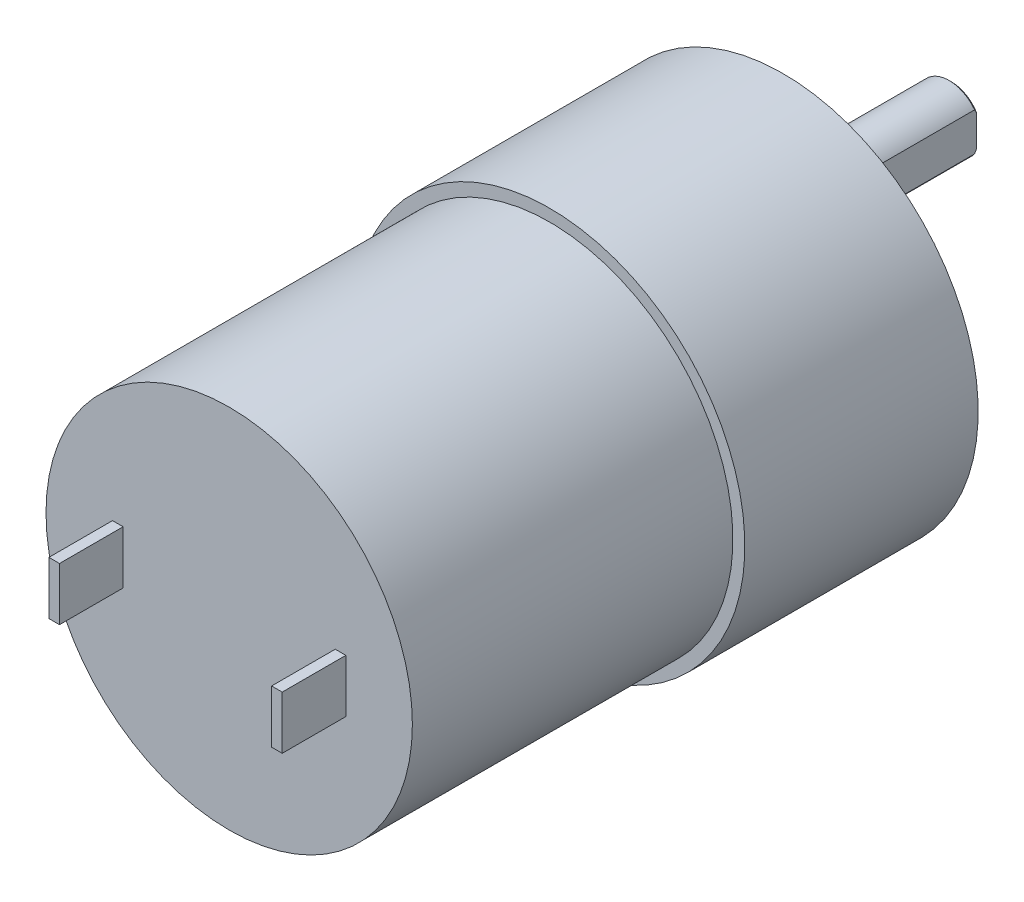
ISO-10303-21;
HEADER;
FILE_DESCRIPTION(('STEP AP214'),'2;1');
FILE_NAME('part.step','',(''),(''),'','','');
FILE_SCHEMA(('AUTOMOTIVE_DESIGN { 1 0 10303 214 1 1 1 1 }'));
ENDSEC;
DATA;
#1=APPLICATION_CONTEXT('core data for automotive mechanical design processes');
#2=APPLICATION_PROTOCOL_DEFINITION('international standard','automotive_design',2000,#1);
#3=PRODUCT_CONTEXT('',#1,'mechanical');
#4=PRODUCT('Part','Part','',(#3));
#5=PRODUCT_RELATED_PRODUCT_CATEGORY('part','',(#4));
#6=PRODUCT_DEFINITION_FORMATION('','',#4);
#7=PRODUCT_DEFINITION_CONTEXT('part definition',#1,'design');
#8=PRODUCT_DEFINITION('design','',#6,#7);
#9=PRODUCT_DEFINITION_SHAPE('','',#8);
#10=(LENGTH_UNIT() NAMED_UNIT(*) SI_UNIT(.MILLI.,.METRE.));
#11=(NAMED_UNIT(*) PLANE_ANGLE_UNIT() SI_UNIT($,.RADIAN.));
#12=(NAMED_UNIT(*) SI_UNIT($,.STERADIAN.) SOLID_ANGLE_UNIT());
#13=UNCERTAINTY_MEASURE_WITH_UNIT(LENGTH_MEASURE(1.E-05),#10,'distance_accuracy_value','');
#14=(GEOMETRIC_REPRESENTATION_CONTEXT(3) GLOBAL_UNCERTAINTY_ASSIGNED_CONTEXT((#13)) GLOBAL_UNIT_ASSIGNED_CONTEXT((#10,
#11,#12)) REPRESENTATION_CONTEXT('',''));
#15=CARTESIAN_POINT('',(0.,0.,0.));
#16=DIRECTION('',(0.,0.,1.));
#17=DIRECTION('',(1.,0.,0.));
#18=AXIS2_PLACEMENT_3D('',#15,#16,#17);
#19=CARTESIAN_POINT('',(-4.6,0.,-22.86));
#20=DIRECTION('',(-1.,0.,0.));
#21=DIRECTION('',(0.,0.,1.));
#22=AXIS2_PLACEMENT_3D('',#19,#20,#21);
#23=PLANE('',#22);
#24=DIRECTION('',(0.,0.,1.));
#25=VECTOR('',#24,1.);
#26=CARTESIAN_POINT('',(-4.6,-1.8,-22.86));
#27=LINE('',#26,#25);
#28=CARTESIAN_POINT('',(-4.6,-1.8,-22.66));
#29=VERTEX_POINT('',#28);
#30=CARTESIAN_POINT('',(-4.6,-1.8,-10.668));
#31=VERTEX_POINT('',#30);
#32=EDGE_CURVE('E252',#29,#31,#27,.T.);
#33=ORIENTED_EDGE('',*,*,#32,.F.);
#34=CARTESIAN_POINT('',(-4.6,-1.8,-22.66));
#35=CARTESIAN_POINT('',(-4.6,-1.77070203501496,-22.6775781337646));
#36=CARTESIAN_POINT('',(-4.6,-1.7412829409263,-22.6949555529574));
#37=CARTESIAN_POINT('',(-4.6,-1.68219669104404,-22.7292652120088));
#38=CARTESIAN_POINT('',(-4.6,-1.65252960207593,-22.7461975670036));
#39=CARTESIAN_POINT('',(-4.6,-1.5929254182054,-22.7795830473789));
#40=CARTESIAN_POINT('',(-4.6,-1.56298831567906,-22.796036159172));
#41=CARTESIAN_POINT('',(-4.6,-1.50282370565395,-22.8284214305054));
#42=CARTESIAN_POINT('',(-4.6,-1.47259612428592,-22.8443534527386));
#43=CARTESIAN_POINT('',(-4.6,-1.44222051018599,-22.8600000000006));
#44=B_SPLINE_CURVE_WITH_KNOTS('',3,(#34,#35,#36,#37,#38,#39,#40,#41,#42,#43),.UNSPECIFIED.,.F.,
.F.,(4,2,2,2,4),(0.,0.102500083338184,0.204973384069477,0.307449587280265,0.409952578891135),.UNSPECIFIED.);
#45=CARTESIAN_POINT('',(-4.6,-1.44222051018562,-22.86));
#46=VERTEX_POINT('',#45);
#47=EDGE_CURVE('E50',#29,#46,#44,.T.);
#48=ORIENTED_EDGE('',*,*,#47,.T.);
#49=DIRECTION('',(0.,-1.,0.));
#50=VECTOR('',#49,1.);
#51=CARTESIAN_POINT('',(-4.6,0.,-22.86));
#52=LINE('',#51,#50);
#53=CARTESIAN_POINT('',(-4.6,1.44222051018561,-22.86));
#54=VERTEX_POINT('',#53);
#55=EDGE_CURVE('E249',#54,#46,#52,.T.);
#56=ORIENTED_EDGE('',*,*,#55,.F.);
#57=CARTESIAN_POINT('',(-4.6,1.44222051018561,-22.86));
#58=CARTESIAN_POINT('',(-4.6,1.47259612428575,-22.8443534527384));
#59=CARTESIAN_POINT('',(-4.6,1.50282370565389,-22.8284214305053));
#60=CARTESIAN_POINT('',(-4.6,1.56298831567908,-22.7960361591721));
#61=CARTESIAN_POINT('',(-4.6,1.5929254182054,-22.7795830473789));
#62=CARTESIAN_POINT('',(-4.6,1.6525296020759,-22.7461975670035));
#63=CARTESIAN_POINT('',(-4.6,1.682196691044,-22.7292652120088));
#64=CARTESIAN_POINT('',(-4.6,1.7412829409263,-22.6949555529574));
#65=CARTESIAN_POINT('',(-4.6,1.77070203501501,-22.6775781337648));
#66=CARTESIAN_POINT('',(-4.6,1.80000000000012,-22.6600000000003));
#67=B_SPLINE_CURVE_WITH_KNOTS('',3,(#57,#58,#59,#60,#61,#62,#63,#64,#65,#66),.UNSPECIFIED.,.F.,
.F.,(4,2,2,2,4),(0.,0.102502991610884,0.204979194821683,0.307452495552973,0.409952578891161),.UNSPECIFIED.);
#68=CARTESIAN_POINT('',(-4.6,1.8,-22.66));
#69=VERTEX_POINT('',#68);
#70=EDGE_CURVE('E270',#54,#69,#67,.T.);
#71=ORIENTED_EDGE('',*,*,#70,.T.);
#72=DIRECTION('',(0.,0.,1.));
#73=VECTOR('',#72,1.);
#74=CARTESIAN_POINT('',(-4.6,1.8,-22.86));
#75=LINE('',#74,#73);
#76=CARTESIAN_POINT('',(-4.6,1.8,-10.668));
#77=VERTEX_POINT('',#76);
#78=EDGE_CURVE('E251',#69,#77,#75,.T.);
#79=ORIENTED_EDGE('',*,*,#78,.T.);
#80=DIRECTION('',(0.,-1.,0.));
#81=VECTOR('',#80,1.);
#82=CARTESIAN_POINT('',(-4.6,0.,-10.668));
#83=LINE('',#82,#81);
#84=EDGE_CURVE('E243',#77,#31,#83,.T.);
#85=ORIENTED_EDGE('',*,*,#84,.T.);
#86=EDGE_LOOP('',(#33,#48,#56,#71,#79,#85));
#87=FACE_BOUND('',#86,.T.);
#88=ADVANCED_FACE('F35',(#87),#23,.F.);
#89=CARTESIAN_POINT('',(0.,0.,-6.5));
#90=DIRECTION('',(0.,0.,1.));
#91=DIRECTION('',(1.,0.,0.));
#92=AXIS2_PLACEMENT_3D('',#89,#90,#91);
#93=PLANE('',#92);
#94=CARTESIAN_POINT('',(-7.,0.,-6.5));
#95=DIRECTION('',(0.,0.,1.));
#96=DIRECTION('',(1.,0.,0.));
#97=AXIS2_PLACEMENT_3D('',#94,#95,#96);
#98=CIRCLE('',#97,5.49999999999993);
#99=CARTESIAN_POINT('',(-1.50000000000007,0.,-6.5));
#100=VERTEX_POINT('',#99);
#101=EDGE_CURVE('E11',#100,#100,#98,.F.);
#102=ORIENTED_EDGE('',*,*,#101,.T.);
#103=EDGE_LOOP('',(#102));
#104=FACE_BOUND('',#103,.T.);
#105=CARTESIAN_POINT('',(-7.,0.,-6.5));
#106=DIRECTION('',(0.,0.,1.));
#107=DIRECTION('',(1.,0.,0.));
#108=AXIS2_PLACEMENT_3D('',#105,#106,#107);
#109=CIRCLE('',#108,3.);
#110=CARTESIAN_POINT('',(-4.,0.,-6.5));
#111=VERTEX_POINT('',#110);
#112=EDGE_CURVE('E261',#111,#111,#109,.T.);
#113=ORIENTED_EDGE('',*,*,#112,.T.);
#114=EDGE_LOOP('',(#113));
#115=FACE_BOUND('',#114,.T.);
#116=ADVANCED_FACE('F287',(#104,#115),#93,.F.);
#117=CARTESIAN_POINT('',(0.,0.,0.));
#118=DIRECTION('',(0.,0.,1.));
#119=DIRECTION('',(1.,0.,0.));
#120=AXIS2_PLACEMENT_3D('',#117,#118,#119);
#121=PLANE('',#120);
#122=CARTESIAN_POINT('',(13.4233937586587,-7.75000000000013,0.));
#123=DIRECTION('',(0.,0.,-1.));
#124=DIRECTION('',(-1.,0.,0.));
#125=AXIS2_PLACEMENT_3D('',#122,#123,#124);
#126=CIRCLE('',#125,1.24999999999999);
#127=CARTESIAN_POINT('',(12.1733937586587,-7.75000000000013,0.));
#128=VERTEX_POINT('',#127);
#129=EDGE_CURVE('E145',#128,#128,#126,.T.);
#130=ORIENTED_EDGE('',*,*,#129,.F.);
#131=EDGE_LOOP('',(#130));
#132=FACE_BOUND('',#131,.T.);
#133=CARTESIAN_POINT('',(0.,-15.5,0.));
#134=DIRECTION('',(0.,0.,-1.));
#135=DIRECTION('',(-1.,0.,0.));
#136=AXIS2_PLACEMENT_3D('',#133,#134,#135);
#137=CIRCLE('',#136,1.24999999999999);
#138=CARTESIAN_POINT('',(-1.24999999999996,-15.5,0.));
#139=VERTEX_POINT('',#138);
#140=EDGE_CURVE('E144',#139,#139,#137,.T.);
#141=ORIENTED_EDGE('',*,*,#140,.F.);
#142=EDGE_LOOP('',(#141));
#143=FACE_BOUND('',#142,.T.);
#144=CARTESIAN_POINT('',(0.,15.5,0.));
#145=DIRECTION('',(0.,0.,-1.));
#146=DIRECTION('',(-1.,0.,0.));
#147=AXIS2_PLACEMENT_3D('',#144,#145,#146);
#148=CIRCLE('',#147,1.24999999999999);
#149=CARTESIAN_POINT('',(-1.24999999999991,15.5,0.));
#150=VERTEX_POINT('',#149);
#151=EDGE_CURVE('E155',#150,#150,#148,.T.);
#152=ORIENTED_EDGE('',*,*,#151,.F.);
#153=EDGE_LOOP('',(#152));
#154=FACE_BOUND('',#153,.T.);
#155=CARTESIAN_POINT('',(-13.4233937586588,7.75000000000004,0.));
#156=DIRECTION('',(0.,0.,-1.));
#157=DIRECTION('',(-1.,0.,0.));
#158=AXIS2_PLACEMENT_3D('',#155,#156,#157);
#159=CIRCLE('',#158,1.24999999999999);
#160=CARTESIAN_POINT('',(-14.6733937586588,7.75000000000004,0.));
#161=VERTEX_POINT('',#160);
#162=EDGE_CURVE('E161',#161,#161,#159,.T.);
#163=ORIENTED_EDGE('',*,*,#162,.F.);
#164=EDGE_LOOP('',(#163));
#165=FACE_BOUND('',#164,.T.);
#166=CARTESIAN_POINT('',(-13.4233937586588,-7.74999999999999,0.));
#167=DIRECTION('',(0.,0.,-1.));
#168=DIRECTION('',(-1.,0.,0.));
#169=AXIS2_PLACEMENT_3D('',#166,#167,#168);
#170=CIRCLE('',#169,1.24999999999999);
#171=CARTESIAN_POINT('',(-14.6733937586588,-7.74999999999999,0.));
#172=VERTEX_POINT('',#171);
#173=EDGE_CURVE('E167',#172,#172,#170,.T.);
#174=ORIENTED_EDGE('',*,*,#173,.F.);
#175=EDGE_LOOP('',(#174));
#176=FACE_BOUND('',#175,.T.);
#177=CARTESIAN_POINT('',(13.4233937586589,7.7499999999999,0.));
#178=DIRECTION('',(0.,0.,-1.));
#179=DIRECTION('',(-1.,0.,0.));
#180=AXIS2_PLACEMENT_3D('',#177,#178,#179);
#181=CIRCLE('',#180,1.24999999999999);
#182=CARTESIAN_POINT('',(12.1733937586589,7.7499999999999,0.));
#183=VERTEX_POINT('',#182);
#184=EDGE_CURVE('E173',#183,#183,#181,.T.);
#185=ORIENTED_EDGE('',*,*,#184,.F.);
#186=EDGE_LOOP('',(#185));
#187=FACE_BOUND('',#186,.T.);
#188=CARTESIAN_POINT('',(-7.,0.,0.));
#189=DIRECTION('',(0.,0.,1.));
#190=DIRECTION('',(1.,0.,0.));
#191=AXIS2_PLACEMENT_3D('',#188,#189,#190);
#192=CIRCLE('',#191,6.);
#193=CARTESIAN_POINT('',(-0.999999999999999,0.,0.));
#194=VERTEX_POINT('',#193);
#195=EDGE_CURVE('E254',#194,#194,#192,.T.);
#196=ORIENTED_EDGE('',*,*,#195,.T.);
#197=EDGE_LOOP('',(#196));
#198=FACE_BOUND('',#197,.T.);
#199=CARTESIAN_POINT('',(0.,0.,0.));
#200=DIRECTION('',(0.,0.,-1.));
#201=DIRECTION('',(-1.,0.,0.));
#202=AXIS2_PLACEMENT_3D('',#199,#200,#201);
#203=CIRCLE('',#202,18.4);
#204=CARTESIAN_POINT('',(-18.4,0.,0.));
#205=VERTEX_POINT('',#204);
#206=EDGE_CURVE('E179',#205,#205,#203,.T.);
#207=ORIENTED_EDGE('',*,*,#206,.T.);
#208=EDGE_LOOP('',(#207));
#209=FACE_BOUND('',#208,.T.);
#210=ADVANCED_FACE('F293',(#132,#143,#154,#165,#176,#187,#198,#209),#121,.F.);
#211=CARTESIAN_POINT('',(-7.,0.,-6.5));
#212=DIRECTION('',(0.,0.,1.));
#213=DIRECTION('',(1.,0.,0.));
#214=AXIS2_PLACEMENT_3D('',#211,#212,#213);
#215=CYLINDRICAL_SURFACE('',#214,6.);
#216=CARTESIAN_POINT('',(-7.,0.,-5.99999999999994));
#217=DIRECTION('',(0.,0.,1.));
#218=DIRECTION('',(1.,0.,0.));
#219=AXIS2_PLACEMENT_3D('',#216,#217,#218);
#220=CIRCLE('',#219,6.);
#221=CARTESIAN_POINT('',(-0.999999999999999,0.,-5.99999999999994));
#222=VERTEX_POINT('',#221);
#223=EDGE_CURVE('E43',#222,#222,#220,.T.);
#224=CARTESIAN_POINT('',(-0.999999999999999,0.,-5.99999999999994));
#225=CARTESIAN_POINT('',(-0.999999999999999,0.,-5.93749999999994));
#226=CARTESIAN_POINT('',(-0.999999999999999,0.,-5.87499999999994));
#227=CARTESIAN_POINT('',(-0.999999999999999,0.,-5.74999999999994));
#228=CARTESIAN_POINT('',(-0.999999999999999,0.,-5.68749999999994));
#229=CARTESIAN_POINT('',(-0.999999999999999,0.,-5.56249999999995));
#230=CARTESIAN_POINT('',(-0.999999999999999,0.,-5.49999999999995));
#231=CARTESIAN_POINT('',(-0.999999999999999,0.,-5.37499999999995));
#232=CARTESIAN_POINT('',(-0.999999999999999,0.,-5.31249999999995));
#233=CARTESIAN_POINT('',(-0.999999999999999,0.,-5.18749999999995));
#234=CARTESIAN_POINT('',(-0.999999999999999,0.,-5.12499999999995));
#235=CARTESIAN_POINT('',(-0.999999999999999,0.,-4.99999999999995));
#236=CARTESIAN_POINT('',(-0.999999999999999,0.,-4.93749999999995));
#237=CARTESIAN_POINT('',(-0.999999999999999,0.,-4.81249999999995));
#238=CARTESIAN_POINT('',(-0.999999999999999,0.,-4.74999999999995));
#239=CARTESIAN_POINT('',(-0.999999999999999,0.,-4.62499999999995));
#240=CARTESIAN_POINT('',(-0.999999999999999,0.,-4.56249999999996));
#241=CARTESIAN_POINT('',(-0.999999999999999,0.,-4.43749999999996));
#242=CARTESIAN_POINT('',(-0.999999999999999,0.,-4.37499999999996));
#243=CARTESIAN_POINT('',(-0.999999999999999,0.,-4.24999999999996));
#244=CARTESIAN_POINT('',(-0.999999999999999,0.,-4.18749999999996));
#245=CARTESIAN_POINT('',(-0.999999999999999,0.,-4.06249999999996));
#246=CARTESIAN_POINT('',(-0.999999999999999,0.,-3.99999999999996));
#247=CARTESIAN_POINT('',(-0.999999999999999,0.,-3.87499999999996));
#248=CARTESIAN_POINT('',(-0.999999999999999,0.,-3.81249999999996));
#249=CARTESIAN_POINT('',(-0.999999999999999,0.,-3.68749999999996));
#250=CARTESIAN_POINT('',(-0.999999999999999,0.,-3.62499999999996));
#251=CARTESIAN_POINT('',(-0.999999999999999,0.,-3.49999999999997));
#252=CARTESIAN_POINT('',(-0.999999999999999,0.,-3.43749999999997));
#253=CARTESIAN_POINT('',(-0.999999999999999,0.,-3.31249999999997));
#254=CARTESIAN_POINT('',(-0.999999999999999,0.,-3.24999999999997));
#255=CARTESIAN_POINT('',(-0.999999999999999,0.,-3.12499999999997));
#256=CARTESIAN_POINT('',(-0.999999999999999,0.,-3.06249999999997));
#257=CARTESIAN_POINT('',(-0.999999999999999,0.,-2.93749999999997));
#258=CARTESIAN_POINT('',(-0.999999999999999,0.,-2.87499999999997));
#259=CARTESIAN_POINT('',(-0.999999999999999,0.,-2.74999999999997));
#260=CARTESIAN_POINT('',(-0.999999999999999,0.,-2.68749999999997));
#261=CARTESIAN_POINT('',(-0.999999999999999,0.,-2.56249999999998));
#262=CARTESIAN_POINT('',(-0.999999999999999,0.,-2.49999999999998));
#263=CARTESIAN_POINT('',(-0.999999999999999,0.,-2.37499999999998));
#264=CARTESIAN_POINT('',(-0.999999999999999,0.,-2.31249999999998));
#265=CARTESIAN_POINT('',(-0.999999999999999,0.,-2.18749999999998));
#266=CARTESIAN_POINT('',(-0.999999999999999,0.,-2.12499999999998));
#267=CARTESIAN_POINT('',(-0.999999999999999,0.,-1.99999999999998));
#268=CARTESIAN_POINT('',(-0.999999999999999,0.,-1.93749999999998));
#269=CARTESIAN_POINT('',(-0.999999999999999,0.,-1.81249999999998));
#270=CARTESIAN_POINT('',(-0.999999999999999,0.,-1.74999999999998));
#271=CARTESIAN_POINT('',(-0.999999999999999,0.,-1.62499999999998));
#272=CARTESIAN_POINT('',(-0.999999999999999,0.,-1.56249999999999));
#273=CARTESIAN_POINT('',(-0.999999999999999,0.,-1.43749999999999));
#274=CARTESIAN_POINT('',(-0.999999999999999,0.,-1.37499999999999));
#275=CARTESIAN_POINT('',(-0.999999999999999,0.,-1.24999999999999));
#276=CARTESIAN_POINT('',(-0.999999999999999,0.,-1.18749999999999));
#277=CARTESIAN_POINT('',(-0.999999999999999,0.,-1.06249999999999));
#278=CARTESIAN_POINT('',(-0.999999999999999,0.,-0.99999999999999));
#279=CARTESIAN_POINT('',(-0.999999999999999,0.,-0.874999999999991));
#280=CARTESIAN_POINT('',(-0.999999999999999,0.,-0.812499999999991));
#281=CARTESIAN_POINT('',(-0.999999999999999,0.,-0.687499999999993));
#282=CARTESIAN_POINT('',(-0.999999999999999,0.,-0.624999999999993));
#283=CARTESIAN_POINT('',(-0.999999999999999,0.,-0.499999999999995));
#284=CARTESIAN_POINT('',(-0.999999999999999,0.,-0.437499999999996));
#285=CARTESIAN_POINT('',(-0.999999999999999,0.,-0.312499999999997));
#286=CARTESIAN_POINT('',(-0.999999999999999,0.,-0.249999999999998));
#287=CARTESIAN_POINT('',(-0.999999999999999,0.,-0.124999999999999));
#288=CARTESIAN_POINT('',(-0.999999999999999,0.,-0.0624999999999993));
#289=CARTESIAN_POINT('',(-0.999999999999999,0.,0.));
#290=B_SPLINE_CURVE_WITH_KNOTS('',3,(#224,#225,#226,#227,#228,#229,#230,#231,#232,#233,#234,
#235,#236,#237,#238,#239,#240,#241,#242,#243,#244,#245,#246,#247,#248,#249,#250,#251,#252,#253,
#254,#255,#256,#257,#258,#259,#260,#261,#262,#263,#264,#265,#266,#267,#268,#269,#270,#271,#272,
#273,#274,#275,#276,#277,#278,#279,#280,#281,#282,#283,#284,#285,#286,#287,#288,#289),
.UNSPECIFIED.,.F.,.F.,(4,2,2,2,2,2,2,2,2,2,2,2,2,2,2,2,2,2,2,2,2,2,2,2,2,2,2,2,2,2,2,2,4),(0.,
0.187499999999998,0.374999999999997,0.562499999999994,0.749999999999993,0.937499999999991,
1.12499999999999,1.31249999999999,1.49999999999999,1.68749999999998,1.87499999999998,
2.06249999999998,2.24999999999998,2.43749999999998,2.62499999999998,2.81249999999997,
2.99999999999997,3.18749999999997,3.37499999999997,3.56249999999997,3.74999999999996,
3.93749999999996,4.12499999999996,4.31249999999996,4.49999999999996,4.68749999999995,
4.87499999999995,5.06249999999995,5.24999999999995,5.43749999999995,5.62499999999994,
5.81249999999994,5.99999999999994),.UNSPECIFIED.);
#291=EDGE_CURVE('BSEAM295',#222,#194,#290,.T.);
#292=ORIENTED_EDGE('',*,*,#223,.T.);
#293=ORIENTED_EDGE('',*,*,#195,.F.);
#294=ORIENTED_EDGE('',*,*,#291,.T.);
#295=ORIENTED_EDGE('',*,*,#291,.F.);
#296=EDGE_LOOP('',(#292,#294,#293,#295));
#297=FACE_BOUND('',#296,.T.);
#298=ADVANCED_FACE('F295',(#297),#215,.T.);
#299=CARTESIAN_POINT('',(-7.,0.,-22.86));
#300=DIRECTION('',(0.,0.,1.));
#301=DIRECTION('',(1.,0.,0.));
#302=AXIS2_PLACEMENT_3D('',#299,#300,#301);
#303=CYLINDRICAL_SURFACE('',#302,3.);
#304=ORIENTED_EDGE('',*,*,#112,.F.);
#305=EDGE_LOOP('',(#304));
#306=FACE_BOUND('',#305,.T.);
#307=ORIENTED_EDGE('',*,*,#78,.F.);
#308=CARTESIAN_POINT('',(-7.,0.,-22.66));
#309=DIRECTION('',(0.,0.,1.));
#310=DIRECTION('',(1.,0.,0.));
#311=AXIS2_PLACEMENT_3D('',#308,#309,#310);
#312=CIRCLE('',#311,3.);
#313=EDGE_CURVE('E267',#69,#29,#312,.T.);
#314=ORIENTED_EDGE('',*,*,#313,.T.);
#315=ORIENTED_EDGE('',*,*,#32,.T.);
#316=CARTESIAN_POINT('',(-7.,0.,-10.668));
#317=DIRECTION('',(0.,0.,1.));
#318=DIRECTION('',(1.,0.,0.));
#319=AXIS2_PLACEMENT_3D('',#316,#317,#318);
#320=CIRCLE('',#319,3.);
#321=EDGE_CURVE('E246',#31,#77,#320,.T.);
#322=ORIENTED_EDGE('',*,*,#321,.T.);
#323=EDGE_LOOP('',(#307,#314,#315,#322));
#324=FACE_BOUND('',#323,.T.);
#325=ADVANCED_FACE('F288',(#306,#324),#303,.T.);
#326=CARTESIAN_POINT('',(0.,0.,-22.86));
#327=DIRECTION('',(0.,0.,1.));
#328=DIRECTION('',(1.,0.,0.));
#329=AXIS2_PLACEMENT_3D('',#326,#327,#328);
#330=PLANE('',#329);
#331=ORIENTED_EDGE('',*,*,#55,.T.);
#332=CARTESIAN_POINT('',(-7.,0.,-22.86));
#333=DIRECTION('',(0.,0.,1.));
#334=DIRECTION('',(1.,0.,0.));
#335=AXIS2_PLACEMENT_3D('',#332,#333,#334);
#336=CIRCLE('',#335,2.80000000000001);
#337=EDGE_CURVE('E56',#46,#54,#336,.F.);
#338=ORIENTED_EDGE('',*,*,#337,.T.);
#339=EDGE_LOOP('',(#331,#338));
#340=FACE_BOUND('',#339,.T.);
#341=ADVANCED_FACE('F333',(#340),#330,.F.);
#342=CARTESIAN_POINT('',(0.,0.,-10.668));
#343=DIRECTION('',(0.,0.,1.));
#344=DIRECTION('',(1.,0.,0.));
#345=AXIS2_PLACEMENT_3D('',#342,#343,#344);
#346=PLANE('',#345);
#347=ORIENTED_EDGE('',*,*,#84,.F.);
#348=ORIENTED_EDGE('',*,*,#321,.F.);
#349=EDGE_LOOP('',(#347,#348));
#350=FACE_BOUND('',#349,.T.);
#351=ADVANCED_FACE('F323',(#350),#346,.F.);
#352=CARTESIAN_POINT('',(0.,0.,22.));
#353=DIRECTION('',(0.,0.,-1.));
#354=DIRECTION('',(-1.,0.,0.));
#355=AXIS2_PLACEMENT_3D('',#352,#353,#354);
#356=PLANE('',#355);
#357=CARTESIAN_POINT('',(0.,0.,22.));
#358=DIRECTION('',(0.,0.,-1.));
#359=DIRECTION('',(-1.,0.,0.));
#360=AXIS2_PLACEMENT_3D('',#357,#358,#359);
#361=CIRCLE('',#360,18.4);
#362=CARTESIAN_POINT('',(-18.4,0.,22.));
#363=VERTEX_POINT('',#362);
#364=EDGE_CURVE('E180',#363,#363,#361,.T.);
#365=ORIENTED_EDGE('',*,*,#364,.F.);
#366=EDGE_LOOP('',(#365));
#367=FACE_BOUND('',#366,.T.);
#368=CARTESIAN_POINT('',(0.,0.,22.));
#369=DIRECTION('',(0.,0.,-1.));
#370=DIRECTION('',(-1.,0.,0.));
#371=AXIS2_PLACEMENT_3D('',#368,#369,#370);
#372=CIRCLE('',#371,17.272);
#373=CARTESIAN_POINT('',(-17.272,0.,22.));
#374=VERTEX_POINT('',#373);
#375=EDGE_CURVE('E264',#374,#374,#372,.T.);
#376=ORIENTED_EDGE('',*,*,#375,.T.);
#377=EDGE_LOOP('',(#376));
#378=FACE_BOUND('',#377,.T.);
#379=ADVANCED_FACE('F320',(#367,#378),#356,.F.);
#380=CARTESIAN_POINT('',(0.,0.,22.));
#381=DIRECTION('',(0.,0.,-1.));
#382=DIRECTION('',(-1.,0.,0.));
#383=AXIS2_PLACEMENT_3D('',#380,#381,#382);
#384=CYLINDRICAL_SURFACE('',#383,18.4);
#385=ORIENTED_EDGE('',*,*,#364,.T.);
#386=EDGE_LOOP('',(#385));
#387=FACE_BOUND('',#386,.T.);
#388=ORIENTED_EDGE('',*,*,#206,.F.);
#389=EDGE_LOOP('',(#388));
#390=FACE_BOUND('',#389,.T.);
#391=ADVANCED_FACE('F322',(#387,#390),#384,.T.);
#392=CARTESIAN_POINT('',(0.,0.,58.22));
#393=DIRECTION('',(0.,0.,1.));
#394=DIRECTION('',(1.,0.,0.));
#395=AXIS2_PLACEMENT_3D('',#392,#393,#394);
#396=PLANE('',#395);
#397=DIRECTION('',(-1.,0.,0.));
#398=VECTOR('',#397,1.);
#399=CARTESIAN_POINT('',(11.,2.5,58.22));
#400=LINE('',#399,#398);
#401=CARTESIAN_POINT('',(11.,2.5,58.22));
#402=VERTEX_POINT('',#401);
#403=CARTESIAN_POINT('',(10.,2.5,58.22));
#404=VERTEX_POINT('',#403);
#405=EDGE_CURVE('E186',#402,#404,#400,.T.);
#406=ORIENTED_EDGE('',*,*,#405,.T.);
#407=DIRECTION('',(0.,-1.,0.));
#408=VECTOR('',#407,1.);
#409=CARTESIAN_POINT('',(10.,2.5,58.22));
#410=LINE('',#409,#408);
#411=CARTESIAN_POINT('',(10.,-2.5,58.22));
#412=VERTEX_POINT('',#411);
#413=EDGE_CURVE('E189',#404,#412,#410,.T.);
#414=ORIENTED_EDGE('',*,*,#413,.T.);
#415=DIRECTION('',(1.,0.,0.));
#416=VECTOR('',#415,1.);
#417=CARTESIAN_POINT('',(11.,-2.5,58.22));
#418=LINE('',#417,#416);
#419=CARTESIAN_POINT('',(11.,-2.5,58.22));
#420=VERTEX_POINT('',#419);
#421=EDGE_CURVE('E192',#412,#420,#418,.T.);
#422=ORIENTED_EDGE('',*,*,#421,.T.);
#423=DIRECTION('',(0.,1.,0.));
#424=VECTOR('',#423,1.);
#425=CARTESIAN_POINT('',(11.,2.5,58.22));
#426=LINE('',#425,#424);
#427=EDGE_CURVE('E194',#420,#402,#426,.T.);
#428=ORIENTED_EDGE('',*,*,#427,.T.);
#429=EDGE_LOOP('',(#406,#414,#422,#428));
#430=FACE_BOUND('',#429,.T.);
#431=ADVANCED_FACE('F330',(#430),#396,.T.);
#432=CARTESIAN_POINT('',(0.,0.,58.22));
#433=DIRECTION('',(0.,0.,1.));
#434=DIRECTION('',(1.,0.,0.));
#435=AXIS2_PLACEMENT_3D('',#432,#433,#434);
#436=PLANE('',#435);
#437=DIRECTION('',(0.,-1.,0.));
#438=VECTOR('',#437,1.);
#439=CARTESIAN_POINT('',(-11.,2.5,58.22));
#440=LINE('',#439,#438);
#441=CARTESIAN_POINT('',(-11.,2.5,58.22));
#442=VERTEX_POINT('',#441);
#443=CARTESIAN_POINT('',(-11.,-2.5,58.22));
#444=VERTEX_POINT('',#443);
#445=EDGE_CURVE('E215',#442,#444,#440,.T.);
#446=ORIENTED_EDGE('',*,*,#445,.T.);
#447=DIRECTION('',(1.,0.,0.));
#448=VECTOR('',#447,1.);
#449=CARTESIAN_POINT('',(-11.,-2.5,58.22));
#450=LINE('',#449,#448);
#451=CARTESIAN_POINT('',(-10.,-2.5,58.22));
#452=VERTEX_POINT('',#451);
#453=EDGE_CURVE('E218',#444,#452,#450,.T.);
#454=ORIENTED_EDGE('',*,*,#453,.T.);
#455=DIRECTION('',(0.,1.,0.));
#456=VECTOR('',#455,1.);
#457=CARTESIAN_POINT('',(-10.,2.5,58.22));
#458=LINE('',#457,#456);
#459=CARTESIAN_POINT('',(-10.,2.5,58.22));
#460=VERTEX_POINT('',#459);
#461=EDGE_CURVE('E221',#452,#460,#458,.T.);
#462=ORIENTED_EDGE('',*,*,#461,.T.);
#463=DIRECTION('',(-1.,0.,0.));
#464=VECTOR('',#463,1.);
#465=CARTESIAN_POINT('',(-11.,2.5,58.22));
#466=LINE('',#465,#464);
#467=EDGE_CURVE('E223',#460,#442,#466,.T.);
#468=ORIENTED_EDGE('',*,*,#467,.T.);
#469=EDGE_LOOP('',(#446,#454,#462,#468));
#470=FACE_BOUND('',#469,.T.);
#471=ADVANCED_FACE('F341',(#470),#436,.T.);
#472=CARTESIAN_POINT('',(11.,-2.5,58.22));
#473=DIRECTION('',(0.,1.,0.));
#474=DIRECTION('',(0.,0.,1.));
#475=AXIS2_PLACEMENT_3D('',#472,#473,#474);
#476=PLANE('',#475);
#477=DIRECTION('',(1.,0.,0.));
#478=VECTOR('',#477,1.);
#479=CARTESIAN_POINT('',(11.,-2.5,52.22));
#480=LINE('',#479,#478);
#481=CARTESIAN_POINT('',(10.,-2.5,52.22));
#482=VERTEX_POINT('',#481);
#483=CARTESIAN_POINT('',(11.,-2.5,52.22));
#484=VERTEX_POINT('',#483);
#485=EDGE_CURVE('E201',#482,#484,#480,.T.);
#486=ORIENTED_EDGE('',*,*,#485,.T.);
#487=DIRECTION('',(0.,0.,-1.));
#488=VECTOR('',#487,1.);
#489=CARTESIAN_POINT('',(11.,-2.5,58.22));
#490=LINE('',#489,#488);
#491=EDGE_CURVE('E207',#420,#484,#490,.T.);
#492=ORIENTED_EDGE('',*,*,#491,.F.);
#493=ORIENTED_EDGE('',*,*,#421,.F.);
#494=DIRECTION('',(0.,0.,-1.));
#495=VECTOR('',#494,1.);
#496=CARTESIAN_POINT('',(10.,-2.5,58.22));
#497=LINE('',#496,#495);
#498=EDGE_CURVE('E209',#412,#482,#497,.T.);
#499=ORIENTED_EDGE('',*,*,#498,.T.);
#500=EDGE_LOOP('',(#486,#492,#493,#499));
#501=FACE_BOUND('',#500,.T.);
#502=ADVANCED_FACE('F347',(#501),#476,.F.);
#503=CARTESIAN_POINT('',(11.,2.5,58.22));
#504=DIRECTION('',(-1.,0.,0.));
#505=DIRECTION('',(0.,0.,1.));
#506=AXIS2_PLACEMENT_3D('',#503,#504,#505);
#507=PLANE('',#506);
#508=DIRECTION('',(0.,1.,0.));
#509=VECTOR('',#508,1.);
#510=CARTESIAN_POINT('',(11.,2.5,52.22));
#511=LINE('',#510,#509);
#512=CARTESIAN_POINT('',(11.,2.5,52.22));
#513=VERTEX_POINT('',#512);
#514=EDGE_CURVE('E190',#484,#513,#511,.T.);
#515=ORIENTED_EDGE('',*,*,#514,.T.);
#516=DIRECTION('',(0.,0.,-1.));
#517=VECTOR('',#516,1.);
#518=CARTESIAN_POINT('',(11.,2.5,58.22));
#519=LINE('',#518,#517);
#520=EDGE_CURVE('E196',#402,#513,#519,.T.);
#521=ORIENTED_EDGE('',*,*,#520,.F.);
#522=ORIENTED_EDGE('',*,*,#427,.F.);
#523=ORIENTED_EDGE('',*,*,#491,.T.);
#524=EDGE_LOOP('',(#515,#521,#522,#523));
#525=FACE_BOUND('',#524,.T.);
#526=ADVANCED_FACE('F343',(#525),#507,.F.);
#527=CARTESIAN_POINT('',(11.,2.5,58.22));
#528=DIRECTION('',(0.,-1.,0.));
#529=DIRECTION('',(0.,0.,-1.));
#530=AXIS2_PLACEMENT_3D('',#527,#528,#529);
#531=PLANE('',#530);
#532=DIRECTION('',(-1.,0.,0.));
#533=VECTOR('',#532,1.);
#534=CARTESIAN_POINT('',(11.,2.5,52.22));
#535=LINE('',#534,#533);
#536=CARTESIAN_POINT('',(10.,2.5,52.22));
#537=VERTEX_POINT('',#536);
#538=EDGE_CURVE('E183',#513,#537,#535,.T.);
#539=ORIENTED_EDGE('',*,*,#538,.T.);
#540=DIRECTION('',(0.,0.,-1.));
#541=VECTOR('',#540,1.);
#542=CARTESIAN_POINT('',(10.,2.5,58.22));
#543=LINE('',#542,#541);
#544=EDGE_CURVE('E212',#404,#537,#543,.T.);
#545=ORIENTED_EDGE('',*,*,#544,.F.);
#546=ORIENTED_EDGE('',*,*,#405,.F.);
#547=ORIENTED_EDGE('',*,*,#520,.T.);
#548=EDGE_LOOP('',(#539,#545,#546,#547));
#549=FACE_BOUND('',#548,.T.);
#550=ADVANCED_FACE('F346',(#549),#531,.F.);
#551=CARTESIAN_POINT('',(10.,2.5,58.22));
#552=DIRECTION('',(1.,0.,0.));
#553=DIRECTION('',(0.,0.,-1.));
#554=AXIS2_PLACEMENT_3D('',#551,#552,#553);
#555=PLANE('',#554);
#556=DIRECTION('',(0.,-1.,0.));
#557=VECTOR('',#556,1.);
#558=CARTESIAN_POINT('',(10.,2.5,52.22));
#559=LINE('',#558,#557);
#560=EDGE_CURVE('E199',#537,#482,#559,.T.);
#561=ORIENTED_EDGE('',*,*,#560,.T.);
#562=ORIENTED_EDGE('',*,*,#498,.F.);
#563=ORIENTED_EDGE('',*,*,#413,.F.);
#564=ORIENTED_EDGE('',*,*,#544,.T.);
#565=EDGE_LOOP('',(#561,#562,#563,#564));
#566=FACE_BOUND('',#565,.T.);
#567=ADVANCED_FACE('F352',(#566),#555,.F.);
#568=CARTESIAN_POINT('',(-10.,2.5,58.22));
#569=DIRECTION('',(-1.,0.,0.));
#570=DIRECTION('',(0.,0.,1.));
#571=AXIS2_PLACEMENT_3D('',#568,#569,#570);
#572=PLANE('',#571);
#573=DIRECTION('',(0.,1.,0.));
#574=VECTOR('',#573,1.);
#575=CARTESIAN_POINT('',(-10.,2.5,52.22));
#576=LINE('',#575,#574);
#577=CARTESIAN_POINT('',(-10.,-2.5,52.22));
#578=VERTEX_POINT('',#577);
#579=CARTESIAN_POINT('',(-10.,2.5,52.22));
#580=VERTEX_POINT('',#579);
#581=EDGE_CURVE('E230',#578,#580,#576,.T.);
#582=ORIENTED_EDGE('',*,*,#581,.T.);
#583=DIRECTION('',(0.,0.,-1.));
#584=VECTOR('',#583,1.);
#585=CARTESIAN_POINT('',(-10.,2.5,58.22));
#586=LINE('',#585,#584);
#587=EDGE_CURVE('E236',#460,#580,#586,.T.);
#588=ORIENTED_EDGE('',*,*,#587,.F.);
#589=ORIENTED_EDGE('',*,*,#461,.F.);
#590=DIRECTION('',(0.,0.,-1.));
#591=VECTOR('',#590,1.);
#592=CARTESIAN_POINT('',(-10.,-2.5,58.22));
#593=LINE('',#592,#591);
#594=EDGE_CURVE('E238',#452,#578,#593,.T.);
#595=ORIENTED_EDGE('',*,*,#594,.T.);
#596=EDGE_LOOP('',(#582,#588,#589,#595));
#597=FACE_BOUND('',#596,.T.);
#598=ADVANCED_FACE('F355',(#597),#572,.F.);
#599=CARTESIAN_POINT('',(-11.,2.5,58.22));
#600=DIRECTION('',(0.,-1.,0.));
#601=DIRECTION('',(0.,0.,-1.));
#602=AXIS2_PLACEMENT_3D('',#599,#600,#601);
#603=PLANE('',#602);
#604=DIRECTION('',(-1.,0.,0.));
#605=VECTOR('',#604,1.);
#606=CARTESIAN_POINT('',(-11.,2.5,52.22));
#607=LINE('',#606,#605);
#608=CARTESIAN_POINT('',(-11.,2.5,52.22));
#609=VERTEX_POINT('',#608);
#610=EDGE_CURVE('E219',#580,#609,#607,.T.);
#611=ORIENTED_EDGE('',*,*,#610,.T.);
#612=DIRECTION('',(0.,0.,-1.));
#613=VECTOR('',#612,1.);
#614=CARTESIAN_POINT('',(-11.,2.5,58.22));
#615=LINE('',#614,#613);
#616=EDGE_CURVE('E225',#442,#609,#615,.T.);
#617=ORIENTED_EDGE('',*,*,#616,.F.);
#618=ORIENTED_EDGE('',*,*,#467,.F.);
#619=ORIENTED_EDGE('',*,*,#587,.T.);
#620=EDGE_LOOP('',(#611,#617,#618,#619));
#621=FACE_BOUND('',#620,.T.);
#622=ADVANCED_FACE('F363',(#621),#603,.F.);
#623=CARTESIAN_POINT('',(-11.,2.5,58.22));
#624=DIRECTION('',(1.,0.,0.));
#625=DIRECTION('',(0.,0.,-1.));
#626=AXIS2_PLACEMENT_3D('',#623,#624,#625);
#627=PLANE('',#626);
#628=DIRECTION('',(0.,-1.,0.));
#629=VECTOR('',#628,1.);
#630=CARTESIAN_POINT('',(-11.,2.5,52.22));
#631=LINE('',#630,#629);
#632=CARTESIAN_POINT('',(-11.,-2.5,52.22));
#633=VERTEX_POINT('',#632);
#634=EDGE_CURVE('E214',#609,#633,#631,.T.);
#635=ORIENTED_EDGE('',*,*,#634,.T.);
#636=DIRECTION('',(0.,0.,-1.));
#637=VECTOR('',#636,1.);
#638=CARTESIAN_POINT('',(-11.,-2.5,58.22));
#639=LINE('',#638,#637);
#640=EDGE_CURVE('E241',#444,#633,#639,.T.);
#641=ORIENTED_EDGE('',*,*,#640,.F.);
#642=ORIENTED_EDGE('',*,*,#445,.F.);
#643=ORIENTED_EDGE('',*,*,#616,.T.);
#644=EDGE_LOOP('',(#635,#641,#642,#643));
#645=FACE_BOUND('',#644,.T.);
#646=ADVANCED_FACE('F366',(#645),#627,.F.);
#647=CARTESIAN_POINT('',(-11.,-2.5,58.22));
#648=DIRECTION('',(0.,1.,0.));
#649=DIRECTION('',(0.,0.,1.));
#650=AXIS2_PLACEMENT_3D('',#647,#648,#649);
#651=PLANE('',#650);
#652=DIRECTION('',(1.,0.,0.));
#653=VECTOR('',#652,1.);
#654=CARTESIAN_POINT('',(-11.,-2.5,52.22));
#655=LINE('',#654,#653);
#656=EDGE_CURVE('E228',#633,#578,#655,.T.);
#657=ORIENTED_EDGE('',*,*,#656,.T.);
#658=ORIENTED_EDGE('',*,*,#594,.F.);
#659=ORIENTED_EDGE('',*,*,#453,.F.);
#660=ORIENTED_EDGE('',*,*,#640,.T.);
#661=EDGE_LOOP('',(#657,#658,#659,#660));
#662=FACE_BOUND('',#661,.T.);
#663=ADVANCED_FACE('F303',(#662),#651,.F.);
#664=CARTESIAN_POINT('',(0.,0.,52.22));
#665=DIRECTION('',(0.,0.,1.));
#666=DIRECTION('',(1.,0.,0.));
#667=AXIS2_PLACEMENT_3D('',#664,#665,#666);
#668=PLANE('',#667);
#669=ORIENTED_EDGE('',*,*,#656,.F.);
#670=ORIENTED_EDGE('',*,*,#634,.F.);
#671=ORIENTED_EDGE('',*,*,#610,.F.);
#672=ORIENTED_EDGE('',*,*,#581,.F.);
#673=EDGE_LOOP('',(#669,#670,#671,#672));
#674=FACE_BOUND('',#673,.T.);
#675=CARTESIAN_POINT('',(0.,0.,52.22));
#676=DIRECTION('',(0.,0.,1.));
#677=DIRECTION('',(1.,0.,0.));
#678=AXIS2_PLACEMENT_3D('',#675,#676,#677);
#679=CIRCLE('',#678,17.272);
#680=CARTESIAN_POINT('',(17.272,0.,52.22));
#681=VERTEX_POINT('',#680);
#682=EDGE_CURVE('E258',#681,#681,#679,.T.);
#683=ORIENTED_EDGE('',*,*,#682,.T.);
#684=EDGE_LOOP('',(#683));
#685=FACE_BOUND('',#684,.T.);
#686=ORIENTED_EDGE('',*,*,#560,.F.);
#687=ORIENTED_EDGE('',*,*,#538,.F.);
#688=ORIENTED_EDGE('',*,*,#514,.F.);
#689=ORIENTED_EDGE('',*,*,#485,.F.);
#690=EDGE_LOOP('',(#686,#687,#688,#689));
#691=FACE_BOUND('',#690,.T.);
#692=ADVANCED_FACE('F299',(#674,#685,#691),#668,.T.);
#693=CARTESIAN_POINT('',(0.,0.,52.22));
#694=DIRECTION('',(0.,0.,-1.));
#695=DIRECTION('',(-1.,0.,0.));
#696=AXIS2_PLACEMENT_3D('',#693,#694,#695);
#697=CYLINDRICAL_SURFACE('',#696,17.272);
#698=ORIENTED_EDGE('',*,*,#682,.F.);
#699=EDGE_LOOP('',(#698));
#700=FACE_BOUND('',#699,.T.);
#701=ORIENTED_EDGE('',*,*,#375,.F.);
#702=EDGE_LOOP('',(#701));
#703=FACE_BOUND('',#702,.T.);
#704=ADVANCED_FACE('F302',(#700,#703),#697,.T.);
#705=CARTESIAN_POINT('',(13.4233937586589,7.7499999999999,3.));
#706=DIRECTION('',(0.,0.,-1.));
#707=DIRECTION('',(-1.,0.,0.));
#708=AXIS2_PLACEMENT_3D('',#705,#706,#707);
#709=CONICAL_SURFACE('',#708,1.25,1.02974425867665);
#710=CARTESIAN_POINT('',(13.4233937586589,7.7499999999999,3.75107577378445));
#711=VERTEX_POINT('',#710);
#712=VERTEX_LOOP('',#711);
#713=FACE_BOUND('',#712,.T.);
#714=CARTESIAN_POINT('',(13.4233937586589,7.7499999999999,3.));
#715=DIRECTION('',(0.,0.,-1.));
#716=DIRECTION('',(-1.,0.,0.));
#717=AXIS2_PLACEMENT_3D('',#714,#715,#716);
#718=CIRCLE('',#717,1.25);
#719=CARTESIAN_POINT('',(12.1733937586589,7.7499999999999,3.));
#720=VERTEX_POINT('',#719);
#721=EDGE_CURVE('E176',#720,#720,#718,.T.);
#722=ORIENTED_EDGE('',*,*,#721,.T.);
#723=EDGE_LOOP('',(#722));
#724=FACE_BOUND('',#723,.T.);
#725=ADVANCED_FACE('F308',(#713,#724),#709,.F.);
#726=CARTESIAN_POINT('',(13.4233937586589,7.7499999999999,0.));
#727=DIRECTION('',(0.,0.,-1.));
#728=DIRECTION('',(-1.,0.,0.));
#729=AXIS2_PLACEMENT_3D('',#726,#727,#728);
#730=CYLINDRICAL_SURFACE('',#729,1.24999999999999);
#731=ORIENTED_EDGE('',*,*,#721,.F.);
#732=EDGE_LOOP('',(#731));
#733=FACE_BOUND('',#732,.T.);
#734=ORIENTED_EDGE('',*,*,#184,.T.);
#735=EDGE_LOOP('',(#734));
#736=FACE_BOUND('',#735,.T.);
#737=ADVANCED_FACE('F313',(#733,#736),#730,.F.);
#738=CARTESIAN_POINT('',(-13.4233937586588,-7.74999999999999,3.));
#739=DIRECTION('',(0.,0.,-1.));
#740=DIRECTION('',(-1.,0.,0.));
#741=AXIS2_PLACEMENT_3D('',#738,#739,#740);
#742=CONICAL_SURFACE('',#741,1.25,1.02974425867665);
#743=CARTESIAN_POINT('',(-13.4233937586588,-7.74999999999999,3.75107577378445));
#744=VERTEX_POINT('',#743);
#745=VERTEX_LOOP('',#744);
#746=FACE_BOUND('',#745,.T.);
#747=CARTESIAN_POINT('',(-13.4233937586588,-7.74999999999999,3.));
#748=DIRECTION('',(0.,0.,-1.));
#749=DIRECTION('',(-1.,0.,0.));
#750=AXIS2_PLACEMENT_3D('',#747,#748,#749);
#751=CIRCLE('',#750,1.25);
#752=CARTESIAN_POINT('',(-14.6733937586588,-7.74999999999999,3.));
#753=VERTEX_POINT('',#752);
#754=EDGE_CURVE('E170',#753,#753,#751,.T.);
#755=ORIENTED_EDGE('',*,*,#754,.T.);
#756=EDGE_LOOP('',(#755));
#757=FACE_BOUND('',#756,.T.);
#758=ADVANCED_FACE('F434',(#746,#757),#742,.F.);
#759=CARTESIAN_POINT('',(-13.4233937586588,-7.74999999999999,0.));
#760=DIRECTION('',(0.,0.,-1.));
#761=DIRECTION('',(-1.,0.,0.));
#762=AXIS2_PLACEMENT_3D('',#759,#760,#761);
#763=CYLINDRICAL_SURFACE('',#762,1.24999999999999);
#764=ORIENTED_EDGE('',*,*,#754,.F.);
#765=EDGE_LOOP('',(#764));
#766=FACE_BOUND('',#765,.T.);
#767=ORIENTED_EDGE('',*,*,#173,.T.);
#768=EDGE_LOOP('',(#767));
#769=FACE_BOUND('',#768,.T.);
#770=ADVANCED_FACE('F430',(#766,#769),#763,.F.);
#771=CARTESIAN_POINT('',(-13.4233937586588,7.75000000000004,3.));
#772=DIRECTION('',(0.,0.,-1.));
#773=DIRECTION('',(-1.,0.,0.));
#774=AXIS2_PLACEMENT_3D('',#771,#772,#773);
#775=CONICAL_SURFACE('',#774,1.25,1.02974425867665);
#776=CARTESIAN_POINT('',(-13.4233937586588,7.75000000000004,3.75107577378445));
#777=VERTEX_POINT('',#776);
#778=VERTEX_LOOP('',#777);
#779=FACE_BOUND('',#778,.T.);
#780=CARTESIAN_POINT('',(-13.4233937586588,7.75000000000004,3.));
#781=DIRECTION('',(0.,0.,-1.));
#782=DIRECTION('',(-1.,0.,0.));
#783=AXIS2_PLACEMENT_3D('',#780,#781,#782);
#784=CIRCLE('',#783,1.25);
#785=CARTESIAN_POINT('',(-14.6733937586588,7.75000000000004,3.));
#786=VERTEX_POINT('',#785);
#787=EDGE_CURVE('E164',#786,#786,#784,.T.);
#788=ORIENTED_EDGE('',*,*,#787,.T.);
#789=EDGE_LOOP('',(#788));
#790=FACE_BOUND('',#789,.T.);
#791=ADVANCED_FACE('F426',(#779,#790),#775,.F.);
#792=CARTESIAN_POINT('',(-13.4233937586588,7.75000000000004,0.));
#793=DIRECTION('',(0.,0.,-1.));
#794=DIRECTION('',(-1.,0.,0.));
#795=AXIS2_PLACEMENT_3D('',#792,#793,#794);
#796=CYLINDRICAL_SURFACE('',#795,1.24999999999999);
#797=ORIENTED_EDGE('',*,*,#787,.F.);
#798=EDGE_LOOP('',(#797));
#799=FACE_BOUND('',#798,.T.);
#800=ORIENTED_EDGE('',*,*,#162,.T.);
#801=EDGE_LOOP('',(#800));
#802=FACE_BOUND('',#801,.T.);
#803=ADVANCED_FACE('F422',(#799,#802),#796,.F.);
#804=CARTESIAN_POINT('',(0.,15.5,3.));
#805=DIRECTION('',(0.,0.,-1.));
#806=DIRECTION('',(-1.,0.,0.));
#807=AXIS2_PLACEMENT_3D('',#804,#805,#806);
#808=CONICAL_SURFACE('',#807,1.25,1.02974425867665);
#809=CARTESIAN_POINT('',(0.,15.5,3.75107577378445));
#810=VERTEX_POINT('',#809);
#811=VERTEX_LOOP('',#810);
#812=FACE_BOUND('',#811,.T.);
#813=CARTESIAN_POINT('',(0.,15.5,3.));
#814=DIRECTION('',(0.,0.,-1.));
#815=DIRECTION('',(-1.,0.,0.));
#816=AXIS2_PLACEMENT_3D('',#813,#814,#815);
#817=CIRCLE('',#816,1.25);
#818=CARTESIAN_POINT('',(-1.24999999999992,15.5,3.));
#819=VERTEX_POINT('',#818);
#820=EDGE_CURVE('E158',#819,#819,#817,.T.);
#821=ORIENTED_EDGE('',*,*,#820,.T.);
#822=EDGE_LOOP('',(#821));
#823=FACE_BOUND('',#822,.T.);
#824=ADVANCED_FACE('F418',(#812,#823),#808,.F.);
#825=CARTESIAN_POINT('',(0.,15.5,0.));
#826=DIRECTION('',(0.,0.,-1.));
#827=DIRECTION('',(-1.,0.,0.));
#828=AXIS2_PLACEMENT_3D('',#825,#826,#827);
#829=CYLINDRICAL_SURFACE('',#828,1.24999999999999);
#830=ORIENTED_EDGE('',*,*,#820,.F.);
#831=EDGE_LOOP('',(#830));
#832=FACE_BOUND('',#831,.T.);
#833=ORIENTED_EDGE('',*,*,#151,.T.);
#834=EDGE_LOOP('',(#833));
#835=FACE_BOUND('',#834,.T.);
#836=ADVANCED_FACE('F414',(#832,#835),#829,.F.);
#837=CARTESIAN_POINT('',(0.,-15.5,3.));
#838=DIRECTION('',(0.,0.,-1.));
#839=DIRECTION('',(-1.,0.,0.));
#840=AXIS2_PLACEMENT_3D('',#837,#838,#839);
#841=CONICAL_SURFACE('',#840,1.25,1.02974425867665);
#842=CARTESIAN_POINT('',(0.,-15.5,3.75107577378445));
#843=VERTEX_POINT('',#842);
#844=VERTEX_LOOP('',#843);
#845=FACE_BOUND('',#844,.T.);
#846=CARTESIAN_POINT('',(0.,-15.5,3.));
#847=DIRECTION('',(0.,0.,-1.));
#848=DIRECTION('',(-1.,0.,0.));
#849=AXIS2_PLACEMENT_3D('',#846,#847,#848);
#850=CIRCLE('',#849,1.25);
#851=CARTESIAN_POINT('',(-1.24999999999997,-15.5,3.));
#852=VERTEX_POINT('',#851);
#853=EDGE_CURVE('E148',#852,#852,#850,.T.);
#854=ORIENTED_EDGE('',*,*,#853,.T.);
#855=EDGE_LOOP('',(#854));
#856=FACE_BOUND('',#855,.T.);
#857=ADVANCED_FACE('F410',(#845,#856),#841,.F.);
#858=CARTESIAN_POINT('',(0.,-15.5,0.));
#859=DIRECTION('',(0.,0.,-1.));
#860=DIRECTION('',(-1.,0.,0.));
#861=AXIS2_PLACEMENT_3D('',#858,#859,#860);
#862=CYLINDRICAL_SURFACE('',#861,1.24999999999999);
#863=ORIENTED_EDGE('',*,*,#853,.F.);
#864=EDGE_LOOP('',(#863));
#865=FACE_BOUND('',#864,.T.);
#866=ORIENTED_EDGE('',*,*,#140,.T.);
#867=EDGE_LOOP('',(#866));
#868=FACE_BOUND('',#867,.T.);
#869=ADVANCED_FACE('F138',(#865,#868),#862,.F.);
#870=CARTESIAN_POINT('',(13.4233937586587,-7.75000000000013,3.));
#871=DIRECTION('',(0.,0.,-1.));
#872=DIRECTION('',(-1.,0.,0.));
#873=AXIS2_PLACEMENT_3D('',#870,#871,#872);
#874=CONICAL_SURFACE('',#873,1.25,1.02974425867665);
#875=CARTESIAN_POINT('',(13.4233937586587,-7.75000000000013,3.75107577378445));
#876=VERTEX_POINT('',#875);
#877=VERTEX_LOOP('',#876);
#878=FACE_BOUND('',#877,.T.);
#879=CARTESIAN_POINT('',(13.4233937586587,-7.75000000000013,3.));
#880=DIRECTION('',(0.,0.,-1.));
#881=DIRECTION('',(-1.,0.,0.));
#882=AXIS2_PLACEMENT_3D('',#879,#880,#881);
#883=CIRCLE('',#882,1.25);
#884=CARTESIAN_POINT('',(12.1733937586587,-7.75000000000013,3.));
#885=VERTEX_POINT('',#884);
#886=EDGE_CURVE('E142',#885,#885,#883,.T.);
#887=ORIENTED_EDGE('',*,*,#886,.T.);
#888=EDGE_LOOP('',(#887));
#889=FACE_BOUND('',#888,.T.);
#890=ADVANCED_FACE('F134',(#878,#889),#874,.F.);
#891=CARTESIAN_POINT('',(13.4233937586587,-7.75000000000013,0.));
#892=DIRECTION('',(0.,0.,-1.));
#893=DIRECTION('',(-1.,0.,0.));
#894=AXIS2_PLACEMENT_3D('',#891,#892,#893);
#895=CYLINDRICAL_SURFACE('',#894,1.24999999999999);
#896=ORIENTED_EDGE('',*,*,#886,.F.);
#897=EDGE_LOOP('',(#896));
#898=FACE_BOUND('',#897,.T.);
#899=ORIENTED_EDGE('',*,*,#129,.T.);
#900=EDGE_LOOP('',(#899));
#901=FACE_BOUND('',#900,.T.);
#902=ADVANCED_FACE('F137',(#898,#901),#895,.F.);
#903=CARTESIAN_POINT('',(-7.,0.,-22.66));
#904=DIRECTION('',(0.,0.,1.));
#905=DIRECTION('',(1.,0.,0.));
#906=AXIS2_PLACEMENT_3D('',#903,#904,#905);
#907=CONICAL_SURFACE('',#906,3.,0.785398163397459);
#908=ORIENTED_EDGE('',*,*,#70,.F.);
#909=ORIENTED_EDGE('',*,*,#337,.F.);
#910=ORIENTED_EDGE('',*,*,#47,.F.);
#911=ORIENTED_EDGE('',*,*,#313,.F.);
#912=EDGE_LOOP('',(#908,#909,#910,#911));
#913=FACE_BOUND('',#912,.T.);
#914=ADVANCED_FACE('F280',(#913),#907,.T.);
#915=CARTESIAN_POINT('',(-7.,0.,-5.99999999999994));
#916=DIRECTION('',(0.,0.,1.));
#917=DIRECTION('',(1.,0.,0.));
#918=AXIS2_PLACEMENT_3D('',#915,#916,#917);
#919=CONICAL_SURFACE('',#918,6.,0.785398163397456);
#920=ORIENTED_EDGE('',*,*,#101,.F.);
#921=EDGE_LOOP('',(#920));
#922=FACE_BOUND('',#921,.T.);
#923=ORIENTED_EDGE('',*,*,#223,.F.);
#924=EDGE_LOOP('',(#923));
#925=FACE_BOUND('',#924,.T.);
#926=ADVANCED_FACE('F37',(#922,#925),#919,.T.);
#927=CLOSED_SHELL('',(#88,#116,#210,#298,#325,#341,#351,#379,#391,#431,#471,#502,#526,#550,#567,
#598,#622,#646,#663,#692,#704,#725,#737,#758,#770,#791,#803,#824,#836,#857,#869,#890,#902,#914,#926));
#928=MANIFOLD_SOLID_BREP('B2',#927);
#929=ADVANCED_BREP_SHAPE_REPRESENTATION('',(#18,#928),#14);
#930=SHAPE_DEFINITION_REPRESENTATION(#9,#929);
ENDSEC;
END-ISO-10303-21;
